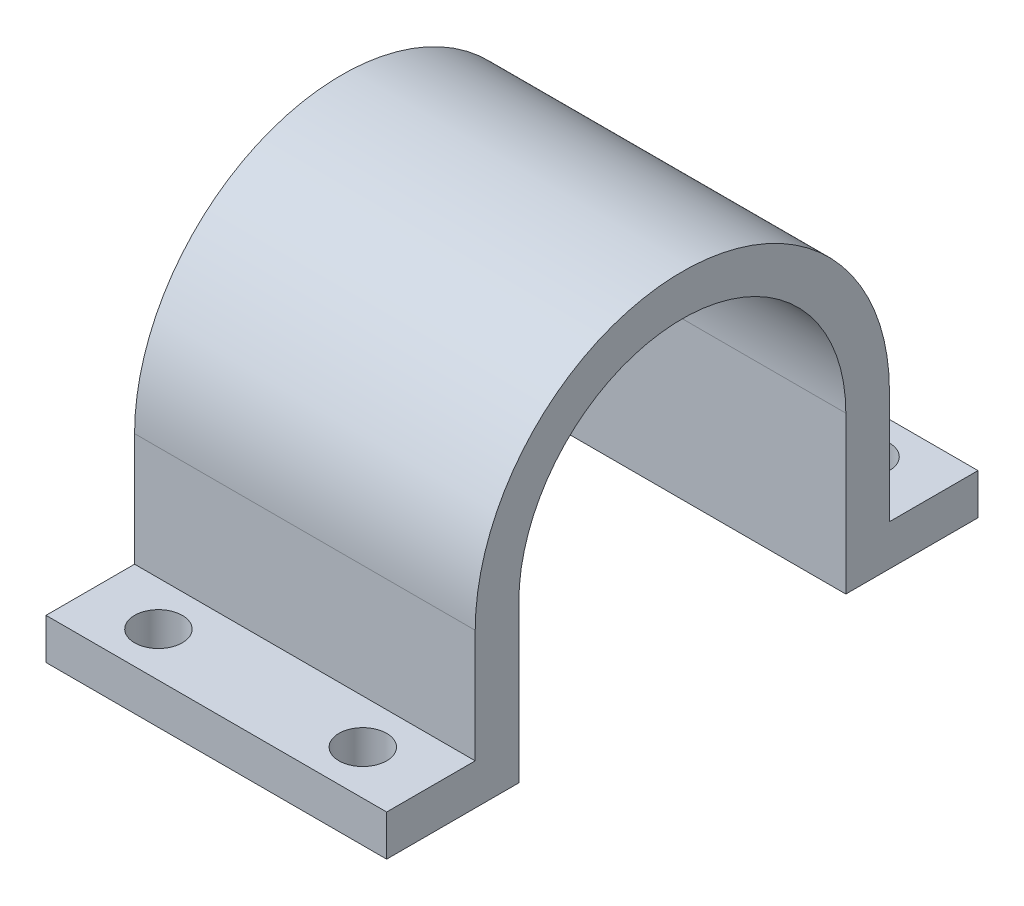
ISO-10303-21;
HEADER;
FILE_DESCRIPTION(('STEP AP214'),'2;1');
FILE_NAME('part.step','',(''),(''),'','','');
FILE_SCHEMA(('AUTOMOTIVE_DESIGN { 1 0 10303 214 1 1 1 1 }'));
ENDSEC;
DATA;
#1=APPLICATION_CONTEXT('core data for automotive mechanical design processes');
#2=APPLICATION_PROTOCOL_DEFINITION('international standard','automotive_design',2000,#1);
#3=PRODUCT_CONTEXT('',#1,'mechanical');
#4=PRODUCT('Part','Part','',(#3));
#5=PRODUCT_RELATED_PRODUCT_CATEGORY('part','',(#4));
#6=PRODUCT_DEFINITION_FORMATION('','',#4);
#7=PRODUCT_DEFINITION_CONTEXT('part definition',#1,'design');
#8=PRODUCT_DEFINITION('design','',#6,#7);
#9=PRODUCT_DEFINITION_SHAPE('','',#8);
#10=(LENGTH_UNIT() NAMED_UNIT(*) SI_UNIT(.MILLI.,.METRE.));
#11=(NAMED_UNIT(*) PLANE_ANGLE_UNIT() SI_UNIT($,.RADIAN.));
#12=(NAMED_UNIT(*) SI_UNIT($,.STERADIAN.) SOLID_ANGLE_UNIT());
#13=UNCERTAINTY_MEASURE_WITH_UNIT(LENGTH_MEASURE(1.E-05),#10,'distance_accuracy_value','');
#14=(GEOMETRIC_REPRESENTATION_CONTEXT(3) GLOBAL_UNCERTAINTY_ASSIGNED_CONTEXT((#13)) GLOBAL_UNIT_ASSIGNED_CONTEXT((#10,
#11,#12)) REPRESENTATION_CONTEXT('',''));
#15=CARTESIAN_POINT('',(0.,0.,0.));
#16=DIRECTION('',(0.,0.,1.));
#17=DIRECTION('',(1.,0.,0.));
#18=AXIS2_PLACEMENT_3D('',#15,#16,#17);
#19=CARTESIAN_POINT('',(25.,0.,-21.7));
#20=DIRECTION('',(0.,1.,0.));
#21=DIRECTION('',(0.,0.,1.));
#22=AXIS2_PLACEMENT_3D('',#19,#20,#21);
#23=PLANE('',#22);
#24=CARTESIAN_POINT('',(20.,0.,18.45));
#25=DIRECTION('',(0.,1.,0.));
#26=DIRECTION('',(0.,0.,1.));
#27=AXIS2_PLACEMENT_3D('',#24,#25,#26);
#28=CIRCLE('',#27,1.75);
#29=CARTESIAN_POINT('',(20.,0.,20.2));
#30=VERTEX_POINT('',#29);
#31=EDGE_CURVE('E285',#30,#30,#28,.T.);
#32=ORIENTED_EDGE('',*,*,#31,.T.);
#33=EDGE_LOOP('',(#32));
#34=FACE_BOUND('',#33,.T.);
#35=CARTESIAN_POINT('',(5.,0.,18.45));
#36=DIRECTION('',(0.,1.,0.));
#37=DIRECTION('',(0.,0.,1.));
#38=AXIS2_PLACEMENT_3D('',#35,#36,#37);
#39=CIRCLE('',#38,1.75);
#40=CARTESIAN_POINT('',(5.,0.,20.2));
#41=VERTEX_POINT('',#40);
#42=EDGE_CURVE('E260',#41,#41,#39,.T.);
#43=ORIENTED_EDGE('',*,*,#42,.T.);
#44=EDGE_LOOP('',(#43));
#45=FACE_BOUND('',#44,.T.);
#46=DIRECTION('',(0.,0.,-1.));
#47=VECTOR('',#46,1.);
#48=CARTESIAN_POINT('',(0.,0.,-21.7));
#49=LINE('',#48,#47);
#50=CARTESIAN_POINT('',(0.,0.,21.7));
#51=VERTEX_POINT('',#50);
#52=CARTESIAN_POINT('',(0.,0.,12.));
#53=VERTEX_POINT('',#52);
#54=EDGE_CURVE('E158',#51,#53,#49,.T.);
#55=ORIENTED_EDGE('',*,*,#54,.T.);
#56=DIRECTION('',(1.,0.,0.));
#57=VECTOR('',#56,1.);
#58=CARTESIAN_POINT('',(0.,0.,12.));
#59=LINE('',#58,#57);
#60=CARTESIAN_POINT('',(25.,0.,12.));
#61=VERTEX_POINT('',#60);
#62=EDGE_CURVE('E243',#53,#61,#59,.T.);
#63=ORIENTED_EDGE('',*,*,#62,.T.);
#64=DIRECTION('',(0.,0.,-1.));
#65=VECTOR('',#64,1.);
#66=CARTESIAN_POINT('',(25.,0.,-21.7));
#67=LINE('',#66,#65);
#68=CARTESIAN_POINT('',(25.,0.,21.7));
#69=VERTEX_POINT('',#68);
#70=EDGE_CURVE('E228',#69,#61,#67,.T.);
#71=ORIENTED_EDGE('',*,*,#70,.F.);
#72=DIRECTION('',(-1.,0.,0.));
#73=VECTOR('',#72,1.);
#74=CARTESIAN_POINT('',(25.,0.,21.7));
#75=LINE('',#74,#73);
#76=EDGE_CURVE('E154',#69,#51,#75,.T.);
#77=ORIENTED_EDGE('',*,*,#76,.T.);
#78=EDGE_LOOP('',(#55,#63,#71,#77));
#79=FACE_BOUND('',#78,.T.);
#80=ADVANCED_FACE('F43',(#34,#45,#79),#23,.F.);
#81=CARTESIAN_POINT('',(5.,0.,-18.45));
#82=DIRECTION('',(0.,1.,0.));
#83=DIRECTION('',(0.,0.,1.));
#84=AXIS2_PLACEMENT_3D('',#81,#82,#83);
#85=CIRCLE('',#84,1.75);
#86=CARTESIAN_POINT('',(5.,0.,-16.7));
#87=VERTEX_POINT('',#86);
#88=EDGE_CURVE('E276',#87,#87,#85,.T.);
#89=ORIENTED_EDGE('',*,*,#88,.T.);
#90=EDGE_LOOP('',(#89));
#91=FACE_BOUND('',#90,.T.);
#92=CARTESIAN_POINT('',(20.,0.,-18.45));
#93=DIRECTION('',(0.,1.,0.));
#94=DIRECTION('',(0.,0.,1.));
#95=AXIS2_PLACEMENT_3D('',#92,#93,#94);
#96=CIRCLE('',#95,1.75);
#97=CARTESIAN_POINT('',(20.,0.,-16.7));
#98=VERTEX_POINT('',#97);
#99=EDGE_CURVE('E292',#98,#98,#96,.T.);
#100=ORIENTED_EDGE('',*,*,#99,.T.);
#101=EDGE_LOOP('',(#100));
#102=FACE_BOUND('',#101,.T.);
#103=CARTESIAN_POINT('',(25.,0.,-12.));
#104=VERTEX_POINT('',#103);
#105=CARTESIAN_POINT('',(25.,0.,-21.7));
#106=VERTEX_POINT('',#105);
#107=EDGE_CURVE('E109',#104,#106,#67,.T.);
#108=ORIENTED_EDGE('',*,*,#107,.F.);
#109=DIRECTION('',(1.,0.,0.));
#110=VECTOR('',#109,1.);
#111=CARTESIAN_POINT('',(0.,0.,-12.));
#112=LINE('',#111,#110);
#113=CARTESIAN_POINT('',(0.,0.,-12.));
#114=VERTEX_POINT('',#113);
#115=EDGE_CURVE('E231',#114,#104,#112,.T.);
#116=ORIENTED_EDGE('',*,*,#115,.F.);
#117=CARTESIAN_POINT('',(0.,0.,-21.7));
#118=VERTEX_POINT('',#117);
#119=EDGE_CURVE('E163',#114,#118,#49,.T.);
#120=ORIENTED_EDGE('',*,*,#119,.T.);
#121=DIRECTION('',(-1.,0.,0.));
#122=VECTOR('',#121,1.);
#123=CARTESIAN_POINT('',(25.,0.,-21.7));
#124=LINE('',#123,#122);
#125=EDGE_CURVE('E11',#106,#118,#124,.T.);
#126=ORIENTED_EDGE('',*,*,#125,.F.);
#127=EDGE_LOOP('',(#108,#116,#120,#126));
#128=FACE_BOUND('',#127,.T.);
#129=ADVANCED_FACE('F45',(#91,#102,#128),#23,.F.);
#130=CARTESIAN_POINT('',(25.,3.,-21.7));
#131=DIRECTION('',(0.,0.,1.));
#132=DIRECTION('',(1.,0.,0.));
#133=AXIS2_PLACEMENT_3D('',#130,#131,#132);
#134=PLANE('',#133);
#135=DIRECTION('',(0.,1.,0.));
#136=VECTOR('',#135,1.);
#137=CARTESIAN_POINT('',(0.,3.,-21.7));
#138=LINE('',#137,#136);
#139=CARTESIAN_POINT('',(0.,3.,-21.7));
#140=VERTEX_POINT('',#139);
#141=EDGE_CURVE('E162',#118,#140,#138,.T.);
#142=ORIENTED_EDGE('',*,*,#141,.T.);
#143=DIRECTION('',(-1.,0.,0.));
#144=VECTOR('',#143,1.);
#145=CARTESIAN_POINT('',(25.,3.,-21.7));
#146=LINE('',#145,#144);
#147=CARTESIAN_POINT('',(25.,3.,-21.7));
#148=VERTEX_POINT('',#147);
#149=EDGE_CURVE('E52',#148,#140,#146,.T.);
#150=ORIENTED_EDGE('',*,*,#149,.F.);
#151=DIRECTION('',(0.,1.,0.));
#152=VECTOR('',#151,1.);
#153=CARTESIAN_POINT('',(25.,3.,-21.7));
#154=LINE('',#153,#152);
#155=EDGE_CURVE('E225',#106,#148,#154,.T.);
#156=ORIENTED_EDGE('',*,*,#155,.F.);
#157=ORIENTED_EDGE('',*,*,#125,.T.);
#158=EDGE_LOOP('',(#142,#150,#156,#157));
#159=FACE_BOUND('',#158,.T.);
#160=ADVANCED_FACE('F303',(#159),#134,.F.);
#161=CARTESIAN_POINT('',(25.,3.,-15.2));
#162=DIRECTION('',(0.,-1.,0.));
#163=DIRECTION('',(0.,0.,-1.));
#164=AXIS2_PLACEMENT_3D('',#161,#162,#163);
#165=PLANE('',#164);
#166=CARTESIAN_POINT('',(5.,3.,-18.45));
#167=DIRECTION('',(0.,1.,0.));
#168=DIRECTION('',(0.,0.,1.));
#169=AXIS2_PLACEMENT_3D('',#166,#167,#168);
#170=CIRCLE('',#169,1.75);
#171=CARTESIAN_POINT('',(5.,3.,-16.7));
#172=VERTEX_POINT('',#171);
#173=EDGE_CURVE('E280',#172,#172,#170,.T.);
#174=ORIENTED_EDGE('',*,*,#173,.F.);
#175=EDGE_LOOP('',(#174));
#176=FACE_BOUND('',#175,.T.);
#177=CARTESIAN_POINT('',(20.,3.,-18.45));
#178=DIRECTION('',(0.,1.,0.));
#179=DIRECTION('',(0.,0.,1.));
#180=AXIS2_PLACEMENT_3D('',#177,#178,#179);
#181=CIRCLE('',#180,1.75);
#182=CARTESIAN_POINT('',(20.,3.,-16.7));
#183=VERTEX_POINT('',#182);
#184=EDGE_CURVE('E281',#183,#183,#181,.T.);
#185=ORIENTED_EDGE('',*,*,#184,.F.);
#186=EDGE_LOOP('',(#185));
#187=FACE_BOUND('',#186,.T.);
#188=DIRECTION('',(0.,0.,1.));
#189=VECTOR('',#188,1.);
#190=CARTESIAN_POINT('',(0.,3.,-15.2));
#191=LINE('',#190,#189);
#192=CARTESIAN_POINT('',(0.,3.,-15.2));
#193=VERTEX_POINT('',#192);
#194=EDGE_CURVE('E166',#140,#193,#191,.T.);
#195=ORIENTED_EDGE('',*,*,#194,.T.);
#196=DIRECTION('',(-1.,0.,0.));
#197=VECTOR('',#196,1.);
#198=CARTESIAN_POINT('',(25.,3.,-15.2));
#199=LINE('',#198,#197);
#200=CARTESIAN_POINT('',(25.,3.,-15.2));
#201=VERTEX_POINT('',#200);
#202=EDGE_CURVE('E192',#201,#193,#199,.T.);
#203=ORIENTED_EDGE('',*,*,#202,.F.);
#204=DIRECTION('',(0.,0.,1.));
#205=VECTOR('',#204,1.);
#206=CARTESIAN_POINT('',(25.,3.,-15.2));
#207=LINE('',#206,#205);
#208=EDGE_CURVE('E203',#148,#201,#207,.T.);
#209=ORIENTED_EDGE('',*,*,#208,.F.);
#210=ORIENTED_EDGE('',*,*,#149,.T.);
#211=EDGE_LOOP('',(#195,#203,#209,#210));
#212=FACE_BOUND('',#211,.T.);
#213=ADVANCED_FACE('F201',(#176,#187,#212),#165,.F.);
#214=CARTESIAN_POINT('',(25.,11.3,-15.2));
#215=DIRECTION('',(0.,0.,1.));
#216=DIRECTION('',(0.,-1.,0.));
#217=AXIS2_PLACEMENT_3D('',#214,#215,#216);
#218=PLANE('',#217);
#219=DIRECTION('',(0.,1.,0.));
#220=VECTOR('',#219,1.);
#221=CARTESIAN_POINT('',(0.,11.3,-15.2));
#222=LINE('',#221,#220);
#223=CARTESIAN_POINT('',(0.,11.3,-15.2));
#224=VERTEX_POINT('',#223);
#225=EDGE_CURVE('E169',#193,#224,#222,.T.);
#226=ORIENTED_EDGE('',*,*,#225,.T.);
#227=DIRECTION('',(-1.,0.,0.));
#228=VECTOR('',#227,1.);
#229=CARTESIAN_POINT('',(25.,11.3,-15.2));
#230=LINE('',#229,#228);
#231=CARTESIAN_POINT('',(25.,11.3,-15.2));
#232=VERTEX_POINT('',#231);
#233=EDGE_CURVE('E188',#232,#224,#230,.T.);
#234=ORIENTED_EDGE('',*,*,#233,.F.);
#235=DIRECTION('',(0.,1.,0.));
#236=VECTOR('',#235,1.);
#237=CARTESIAN_POINT('',(25.,11.3,-15.2));
#238=LINE('',#237,#236);
#239=EDGE_CURVE('E219',#201,#232,#238,.T.);
#240=ORIENTED_EDGE('',*,*,#239,.F.);
#241=ORIENTED_EDGE('',*,*,#202,.T.);
#242=EDGE_LOOP('',(#226,#234,#240,#241));
#243=FACE_BOUND('',#242,.T.);
#244=ADVANCED_FACE('F214',(#243),#218,.F.);
#245=CARTESIAN_POINT('',(25.,11.3,0.));
#246=DIRECTION('',(-1.,0.,0.));
#247=DIRECTION('',(0.,0.,1.));
#248=AXIS2_PLACEMENT_3D('',#245,#246,#247);
#249=CYLINDRICAL_SURFACE('',#248,15.2);
#250=CARTESIAN_POINT('',(0.,11.3,0.));
#251=DIRECTION('',(1.,0.,0.));
#252=DIRECTION('',(0.,0.,1.));
#253=AXIS2_PLACEMENT_3D('',#250,#251,#252);
#254=CIRCLE('',#253,15.2);
#255=CARTESIAN_POINT('',(0.,11.3,15.2));
#256=VERTEX_POINT('',#255);
#257=EDGE_CURVE('E172',#224,#256,#254,.T.);
#258=ORIENTED_EDGE('',*,*,#257,.T.);
#259=DIRECTION('',(-1.,0.,0.));
#260=VECTOR('',#259,1.);
#261=CARTESIAN_POINT('',(25.,11.3,15.2));
#262=LINE('',#261,#260);
#263=CARTESIAN_POINT('',(25.,11.3,15.2));
#264=VERTEX_POINT('',#263);
#265=EDGE_CURVE('E147',#264,#256,#262,.T.);
#266=ORIENTED_EDGE('',*,*,#265,.F.);
#267=CARTESIAN_POINT('',(25.,11.3,0.));
#268=DIRECTION('',(1.,0.,0.));
#269=DIRECTION('',(0.,0.,1.));
#270=AXIS2_PLACEMENT_3D('',#267,#268,#269);
#271=CIRCLE('',#270,15.2);
#272=EDGE_CURVE('E133',#232,#264,#271,.T.);
#273=ORIENTED_EDGE('',*,*,#272,.F.);
#274=ORIENTED_EDGE('',*,*,#233,.T.);
#275=EDGE_LOOP('',(#258,#266,#273,#274));
#276=FACE_BOUND('',#275,.T.);
#277=ADVANCED_FACE('F217',(#276),#249,.T.);
#278=CARTESIAN_POINT('',(25.,11.3,15.2));
#279=DIRECTION('',(0.,0.,-1.));
#280=DIRECTION('',(0.,1.,0.));
#281=AXIS2_PLACEMENT_3D('',#278,#279,#280);
#282=PLANE('',#281);
#283=DIRECTION('',(0.,-1.,0.));
#284=VECTOR('',#283,1.);
#285=CARTESIAN_POINT('',(0.,11.3,15.2));
#286=LINE('',#285,#284);
#287=CARTESIAN_POINT('',(0.,3.,15.2));
#288=VERTEX_POINT('',#287);
#289=EDGE_CURVE('E143',#256,#288,#286,.T.);
#290=ORIENTED_EDGE('',*,*,#289,.T.);
#291=DIRECTION('',(-1.,0.,0.));
#292=VECTOR('',#291,1.);
#293=CARTESIAN_POINT('',(25.,3.,15.2));
#294=LINE('',#293,#292);
#295=CARTESIAN_POINT('',(25.,3.,15.2));
#296=VERTEX_POINT('',#295);
#297=EDGE_CURVE('E140',#296,#288,#294,.T.);
#298=ORIENTED_EDGE('',*,*,#297,.F.);
#299=DIRECTION('',(0.,-1.,0.));
#300=VECTOR('',#299,1.);
#301=CARTESIAN_POINT('',(25.,11.3,15.2));
#302=LINE('',#301,#300);
#303=EDGE_CURVE('E126',#264,#296,#302,.T.);
#304=ORIENTED_EDGE('',*,*,#303,.F.);
#305=ORIENTED_EDGE('',*,*,#265,.T.);
#306=EDGE_LOOP('',(#290,#298,#304,#305));
#307=FACE_BOUND('',#306,.T.);
#308=ADVANCED_FACE('F141',(#307),#282,.F.);
#309=CARTESIAN_POINT('',(25.,3.,21.7));
#310=DIRECTION('',(0.,-1.,0.));
#311=DIRECTION('',(0.,0.,-1.));
#312=AXIS2_PLACEMENT_3D('',#309,#310,#311);
#313=PLANE('',#312);
#314=CARTESIAN_POINT('',(20.,3.,18.45));
#315=DIRECTION('',(0.,1.,0.));
#316=DIRECTION('',(0.,0.,1.));
#317=AXIS2_PLACEMENT_3D('',#314,#315,#316);
#318=CIRCLE('',#317,1.75);
#319=CARTESIAN_POINT('',(20.,3.,20.2));
#320=VERTEX_POINT('',#319);
#321=EDGE_CURVE('E272',#320,#320,#318,.T.);
#322=ORIENTED_EDGE('',*,*,#321,.F.);
#323=EDGE_LOOP('',(#322));
#324=FACE_BOUND('',#323,.T.);
#325=CARTESIAN_POINT('',(5.,3.,18.45));
#326=DIRECTION('',(0.,1.,0.));
#327=DIRECTION('',(0.,0.,1.));
#328=AXIS2_PLACEMENT_3D('',#325,#326,#327);
#329=CIRCLE('',#328,1.75);
#330=CARTESIAN_POINT('',(5.,3.,20.2));
#331=VERTEX_POINT('',#330);
#332=EDGE_CURVE('E268',#331,#331,#329,.T.);
#333=ORIENTED_EDGE('',*,*,#332,.F.);
#334=EDGE_LOOP('',(#333));
#335=FACE_BOUND('',#334,.T.);
#336=DIRECTION('',(0.,0.,1.));
#337=VECTOR('',#336,1.);
#338=CARTESIAN_POINT('',(0.,3.,21.7));
#339=LINE('',#338,#337);
#340=CARTESIAN_POINT('',(0.,3.,21.7));
#341=VERTEX_POINT('',#340);
#342=EDGE_CURVE('E177',#288,#341,#339,.T.);
#343=ORIENTED_EDGE('',*,*,#342,.T.);
#344=DIRECTION('',(-1.,0.,0.));
#345=VECTOR('',#344,1.);
#346=CARTESIAN_POINT('',(25.,3.,21.7));
#347=LINE('',#346,#345);
#348=CARTESIAN_POINT('',(25.,3.,21.7));
#349=VERTEX_POINT('',#348);
#350=EDGE_CURVE('E148',#349,#341,#347,.T.);
#351=ORIENTED_EDGE('',*,*,#350,.F.);
#352=DIRECTION('',(0.,0.,1.));
#353=VECTOR('',#352,1.);
#354=CARTESIAN_POINT('',(25.,3.,21.7));
#355=LINE('',#354,#353);
#356=EDGE_CURVE('E130',#296,#349,#355,.T.);
#357=ORIENTED_EDGE('',*,*,#356,.F.);
#358=ORIENTED_EDGE('',*,*,#297,.T.);
#359=EDGE_LOOP('',(#343,#351,#357,#358));
#360=FACE_BOUND('',#359,.T.);
#361=ADVANCED_FACE('F150',(#324,#335,#360),#313,.F.);
#362=CARTESIAN_POINT('',(25.,0.,21.7));
#363=DIRECTION('',(0.,0.,-1.));
#364=DIRECTION('',(-1.,0.,0.));
#365=AXIS2_PLACEMENT_3D('',#362,#363,#364);
#366=PLANE('',#365);
#367=DIRECTION('',(0.,-1.,0.));
#368=VECTOR('',#367,1.);
#369=CARTESIAN_POINT('',(0.,0.,21.7));
#370=LINE('',#369,#368);
#371=EDGE_CURVE('E101',#341,#51,#370,.T.);
#372=ORIENTED_EDGE('',*,*,#371,.T.);
#373=ORIENTED_EDGE('',*,*,#76,.F.);
#374=DIRECTION('',(0.,-1.,0.));
#375=VECTOR('',#374,1.);
#376=CARTESIAN_POINT('',(25.,0.,21.7));
#377=LINE('',#376,#375);
#378=EDGE_CURVE('E68',#349,#69,#377,.T.);
#379=ORIENTED_EDGE('',*,*,#378,.F.);
#380=ORIENTED_EDGE('',*,*,#350,.T.);
#381=EDGE_LOOP('',(#372,#373,#379,#380));
#382=FACE_BOUND('',#381,.T.);
#383=ADVANCED_FACE('F364',(#382),#366,.F.);
#384=CARTESIAN_POINT('',(25.,11.3,0.));
#385=DIRECTION('',(-1.,0.,0.));
#386=DIRECTION('',(0.,0.,1.));
#387=AXIS2_PLACEMENT_3D('',#384,#385,#386);
#388=PLANE('',#387);
#389=ORIENTED_EDGE('',*,*,#70,.T.);
#390=DIRECTION('',(0.,-1.,0.));
#391=VECTOR('',#390,1.);
#392=CARTESIAN_POINT('',(25.,11.5,12.));
#393=LINE('',#392,#391);
#394=CARTESIAN_POINT('',(25.,11.5,12.));
#395=VERTEX_POINT('',#394);
#396=EDGE_CURVE('E247',#395,#61,#393,.T.);
#397=ORIENTED_EDGE('',*,*,#396,.F.);
#398=CARTESIAN_POINT('',(25.,11.5,0.));
#399=DIRECTION('',(1.,0.,0.));
#400=DIRECTION('',(0.,0.,1.));
#401=AXIS2_PLACEMENT_3D('',#398,#399,#400);
#402=CIRCLE('',#401,12.);
#403=CARTESIAN_POINT('',(25.,11.5,-12.));
#404=VERTEX_POINT('',#403);
#405=EDGE_CURVE('E252',#404,#395,#402,.T.);
#406=ORIENTED_EDGE('',*,*,#405,.F.);
#407=DIRECTION('',(0.,1.,0.));
#408=VECTOR('',#407,1.);
#409=CARTESIAN_POINT('',(25.,11.5,-12.));
#410=LINE('',#409,#408);
#411=EDGE_CURVE('E256',#104,#404,#410,.T.);
#412=ORIENTED_EDGE('',*,*,#411,.F.);
#413=ORIENTED_EDGE('',*,*,#107,.T.);
#414=ORIENTED_EDGE('',*,*,#155,.T.);
#415=ORIENTED_EDGE('',*,*,#208,.T.);
#416=ORIENTED_EDGE('',*,*,#239,.T.);
#417=ORIENTED_EDGE('',*,*,#272,.T.);
#418=ORIENTED_EDGE('',*,*,#303,.T.);
#419=ORIENTED_EDGE('',*,*,#356,.T.);
#420=ORIENTED_EDGE('',*,*,#378,.T.);
#421=EDGE_LOOP('',(#389,#397,#406,#412,#413,#414,#415,#416,#417,#418,#419,#420));
#422=FACE_BOUND('',#421,.T.);
#423=ADVANCED_FACE('F128',(#422),#388,.F.);
#424=CARTESIAN_POINT('',(0.,11.3,0.));
#425=DIRECTION('',(-1.,0.,0.));
#426=DIRECTION('',(0.,0.,1.));
#427=AXIS2_PLACEMENT_3D('',#424,#425,#426);
#428=PLANE('',#427);
#429=DIRECTION('',(0.,-1.,0.));
#430=VECTOR('',#429,1.);
#431=CARTESIAN_POINT('',(0.,11.5,12.));
#432=LINE('',#431,#430);
#433=CARTESIAN_POINT('',(0.,11.5,12.));
#434=VERTEX_POINT('',#433);
#435=EDGE_CURVE('E236',#434,#53,#432,.T.);
#436=ORIENTED_EDGE('',*,*,#435,.T.);
#437=ORIENTED_EDGE('',*,*,#54,.F.);
#438=ORIENTED_EDGE('',*,*,#371,.F.);
#439=ORIENTED_EDGE('',*,*,#342,.F.);
#440=ORIENTED_EDGE('',*,*,#289,.F.);
#441=ORIENTED_EDGE('',*,*,#257,.F.);
#442=ORIENTED_EDGE('',*,*,#225,.F.);
#443=ORIENTED_EDGE('',*,*,#194,.F.);
#444=ORIENTED_EDGE('',*,*,#141,.F.);
#445=ORIENTED_EDGE('',*,*,#119,.F.);
#446=DIRECTION('',(0.,1.,0.));
#447=VECTOR('',#446,1.);
#448=CARTESIAN_POINT('',(0.,11.5,-12.));
#449=LINE('',#448,#447);
#450=CARTESIAN_POINT('',(0.,11.5,-12.));
#451=VERTEX_POINT('',#450);
#452=EDGE_CURVE('E251',#114,#451,#449,.T.);
#453=ORIENTED_EDGE('',*,*,#452,.T.);
#454=CARTESIAN_POINT('',(0.,11.5,0.));
#455=DIRECTION('',(1.,0.,0.));
#456=DIRECTION('',(0.,0.,1.));
#457=AXIS2_PLACEMENT_3D('',#454,#455,#456);
#458=CIRCLE('',#457,12.);
#459=EDGE_CURVE('E59',#451,#434,#458,.T.);
#460=ORIENTED_EDGE('',*,*,#459,.T.);
#461=EDGE_LOOP('',(#436,#437,#438,#439,#440,#441,#442,#443,#444,#445,#453,#460));
#462=FACE_BOUND('',#461,.T.);
#463=ADVANCED_FACE('F209',(#462),#428,.T.);
#464=CARTESIAN_POINT('',(0.,11.5,12.));
#465=DIRECTION('',(0.,0.,1.));
#466=DIRECTION('',(0.,-1.,0.));
#467=AXIS2_PLACEMENT_3D('',#464,#465,#466);
#468=PLANE('',#467);
#469=ORIENTED_EDGE('',*,*,#396,.T.);
#470=ORIENTED_EDGE('',*,*,#62,.F.);
#471=ORIENTED_EDGE('',*,*,#435,.F.);
#472=DIRECTION('',(1.,0.,0.));
#473=VECTOR('',#472,1.);
#474=CARTESIAN_POINT('',(0.,11.5,12.));
#475=LINE('',#474,#473);
#476=EDGE_CURVE('E239',#434,#395,#475,.T.);
#477=ORIENTED_EDGE('',*,*,#476,.T.);
#478=EDGE_LOOP('',(#469,#470,#471,#477));
#479=FACE_BOUND('',#478,.T.);
#480=ADVANCED_FACE('F329',(#479),#468,.F.);
#481=CARTESIAN_POINT('',(0.,11.5,0.));
#482=DIRECTION('',(1.,0.,0.));
#483=DIRECTION('',(0.,0.,-1.));
#484=AXIS2_PLACEMENT_3D('',#481,#482,#483);
#485=CYLINDRICAL_SURFACE('',#484,12.);
#486=ORIENTED_EDGE('',*,*,#405,.T.);
#487=ORIENTED_EDGE('',*,*,#476,.F.);
#488=ORIENTED_EDGE('',*,*,#459,.F.);
#489=DIRECTION('',(1.,0.,0.));
#490=VECTOR('',#489,1.);
#491=CARTESIAN_POINT('',(0.,11.5,-12.));
#492=LINE('',#491,#490);
#493=EDGE_CURVE('E235',#451,#404,#492,.T.);
#494=ORIENTED_EDGE('',*,*,#493,.T.);
#495=EDGE_LOOP('',(#486,#487,#488,#494));
#496=FACE_BOUND('',#495,.T.);
#497=ADVANCED_FACE('F341',(#496),#485,.F.);
#498=CARTESIAN_POINT('',(0.,11.5,-12.));
#499=DIRECTION('',(0.,0.,-1.));
#500=DIRECTION('',(0.,1.,0.));
#501=AXIS2_PLACEMENT_3D('',#498,#499,#500);
#502=PLANE('',#501);
#503=ORIENTED_EDGE('',*,*,#411,.T.);
#504=ORIENTED_EDGE('',*,*,#493,.F.);
#505=ORIENTED_EDGE('',*,*,#452,.F.);
#506=ORIENTED_EDGE('',*,*,#115,.T.);
#507=EDGE_LOOP('',(#503,#504,#505,#506));
#508=FACE_BOUND('',#507,.T.);
#509=ADVANCED_FACE('F343',(#508),#502,.F.);
#510=CARTESIAN_POINT('',(5.,0.,18.45));
#511=DIRECTION('',(0.,1.,0.));
#512=DIRECTION('',(0.,0.,1.));
#513=AXIS2_PLACEMENT_3D('',#510,#511,#512);
#514=CYLINDRICAL_SURFACE('',#513,1.75);
#515=ORIENTED_EDGE('',*,*,#42,.F.);
#516=EDGE_LOOP('',(#515));
#517=FACE_BOUND('',#516,.T.);
#518=ORIENTED_EDGE('',*,*,#332,.T.);
#519=EDGE_LOOP('',(#518));
#520=FACE_BOUND('',#519,.T.);
#521=ADVANCED_FACE('F350',(#517,#520),#514,.F.);
#522=CARTESIAN_POINT('',(20.,0.,18.45));
#523=DIRECTION('',(0.,1.,0.));
#524=DIRECTION('',(0.,0.,1.));
#525=AXIS2_PLACEMENT_3D('',#522,#523,#524);
#526=CYLINDRICAL_SURFACE('',#525,1.75);
#527=ORIENTED_EDGE('',*,*,#31,.F.);
#528=EDGE_LOOP('',(#527));
#529=FACE_BOUND('',#528,.T.);
#530=ORIENTED_EDGE('',*,*,#321,.T.);
#531=EDGE_LOOP('',(#530));
#532=FACE_BOUND('',#531,.T.);
#533=ADVANCED_FACE('F356',(#529,#532),#526,.F.);
#534=CARTESIAN_POINT('',(20.,0.,-18.45));
#535=DIRECTION('',(0.,1.,0.));
#536=DIRECTION('',(0.,0.,1.));
#537=AXIS2_PLACEMENT_3D('',#534,#535,#536);
#538=CYLINDRICAL_SURFACE('',#537,1.75);
#539=ORIENTED_EDGE('',*,*,#99,.F.);
#540=EDGE_LOOP('',(#539));
#541=FACE_BOUND('',#540,.T.);
#542=ORIENTED_EDGE('',*,*,#184,.T.);
#543=EDGE_LOOP('',(#542));
#544=FACE_BOUND('',#543,.T.);
#545=ADVANCED_FACE('F300',(#541,#544),#538,.F.);
#546=CARTESIAN_POINT('',(5.,0.,-18.45));
#547=DIRECTION('',(0.,1.,0.));
#548=DIRECTION('',(0.,0.,1.));
#549=AXIS2_PLACEMENT_3D('',#546,#547,#548);
#550=CYLINDRICAL_SURFACE('',#549,1.75);
#551=ORIENTED_EDGE('',*,*,#88,.F.);
#552=EDGE_LOOP('',(#551));
#553=FACE_BOUND('',#552,.T.);
#554=ORIENTED_EDGE('',*,*,#173,.T.);
#555=EDGE_LOOP('',(#554));
#556=FACE_BOUND('',#555,.T.);
#557=ADVANCED_FACE('F498',(#553,#556),#550,.F.);
#558=CLOSED_SHELL('',(#80,#129,#160,#213,#244,#277,#308,#361,#383,#423,#463,#480,#497,#509,#521,
#533,#545,#557));
#559=MANIFOLD_SOLID_BREP('B2',#558);
#560=ADVANCED_BREP_SHAPE_REPRESENTATION('',(#18,#559),#14);
#561=SHAPE_DEFINITION_REPRESENTATION(#9,#560);
ENDSEC;
END-ISO-10303-21;
